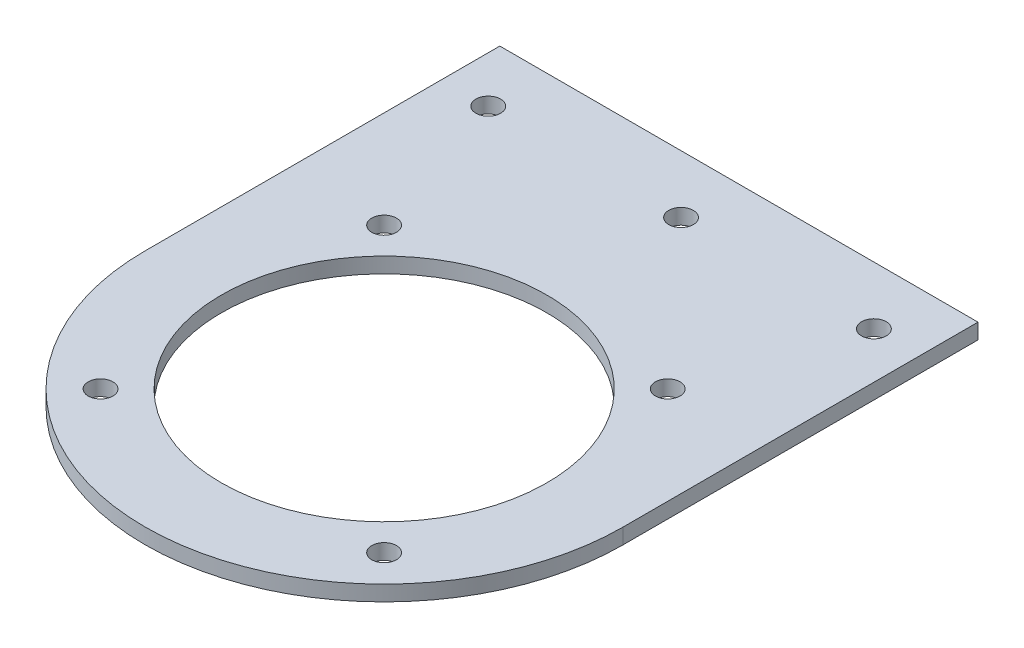
ISO-10303-21;
HEADER;
FILE_DESCRIPTION(('STEP AP214'),'2;1');
FILE_NAME('part.step','',(''),(''),'','','');
FILE_SCHEMA(('AUTOMOTIVE_DESIGN { 1 0 10303 214 1 1 1 1 }'));
ENDSEC;
DATA;
#1=APPLICATION_CONTEXT('core data for automotive mechanical design processes');
#2=APPLICATION_PROTOCOL_DEFINITION('international standard','automotive_design',2000,#1);
#3=PRODUCT_CONTEXT('',#1,'mechanical');
#4=PRODUCT('Part','Part','',(#3));
#5=PRODUCT_RELATED_PRODUCT_CATEGORY('part','',(#4));
#6=PRODUCT_DEFINITION_FORMATION('','',#4);
#7=PRODUCT_DEFINITION_CONTEXT('part definition',#1,'design');
#8=PRODUCT_DEFINITION('design','',#6,#7);
#9=PRODUCT_DEFINITION_SHAPE('','',#8);
#10=(LENGTH_UNIT() NAMED_UNIT(*) SI_UNIT(.MILLI.,.METRE.));
#11=(NAMED_UNIT(*) PLANE_ANGLE_UNIT() SI_UNIT($,.RADIAN.));
#12=(NAMED_UNIT(*) SI_UNIT($,.STERADIAN.) SOLID_ANGLE_UNIT());
#13=UNCERTAINTY_MEASURE_WITH_UNIT(LENGTH_MEASURE(1.E-05),#10,'distance_accuracy_value','');
#14=(GEOMETRIC_REPRESENTATION_CONTEXT(3) GLOBAL_UNCERTAINTY_ASSIGNED_CONTEXT((#13)) GLOBAL_UNIT_ASSIGNED_CONTEXT((#10,
#11,#12)) REPRESENTATION_CONTEXT('',''));
#15=CARTESIAN_POINT('',(0.,0.,0.));
#16=DIRECTION('',(0.,0.,1.));
#17=DIRECTION('',(1.,0.,0.));
#18=AXIS2_PLACEMENT_3D('',#15,#16,#17);
#19=CARTESIAN_POINT('',(-31.,2.,0.));
#20=DIRECTION('',(-1.,0.,0.));
#21=DIRECTION('',(0.,0.,1.));
#22=AXIS2_PLACEMENT_3D('',#19,#20,#21);
#23=PLANE('',#22);
#24=DIRECTION('',(0.,0.,-1.));
#25=VECTOR('',#24,1.);
#26=CARTESIAN_POINT('',(-31.,0.,0.));
#27=LINE('',#26,#25);
#28=CARTESIAN_POINT('',(-31.,0.,0.));
#29=VERTEX_POINT('',#28);
#30=CARTESIAN_POINT('',(-31.,0.,-46.));
#31=VERTEX_POINT('',#30);
#32=EDGE_CURVE('E148',#29,#31,#27,.T.);
#33=ORIENTED_EDGE('',*,*,#32,.F.);
#34=DIRECTION('',(0.,-1.,0.));
#35=VECTOR('',#34,1.);
#36=CARTESIAN_POINT('',(-31.,2.,0.));
#37=LINE('',#36,#35);
#38=CARTESIAN_POINT('',(-31.,2.,0.));
#39=VERTEX_POINT('',#38);
#40=EDGE_CURVE('E11',#39,#29,#37,.T.);
#41=ORIENTED_EDGE('',*,*,#40,.F.);
#42=DIRECTION('',(0.,0.,-1.));
#43=VECTOR('',#42,1.);
#44=CARTESIAN_POINT('',(-31.,2.,0.));
#45=LINE('',#44,#43);
#46=CARTESIAN_POINT('',(-31.,2.,-46.));
#47=VERTEX_POINT('',#46);
#48=EDGE_CURVE('E97',#39,#47,#45,.T.);
#49=ORIENTED_EDGE('',*,*,#48,.T.);
#50=DIRECTION('',(0.,-1.,0.));
#51=VECTOR('',#50,1.);
#52=CARTESIAN_POINT('',(-31.,2.,-46.));
#53=LINE('',#52,#51);
#54=EDGE_CURVE('E64',#47,#31,#53,.T.);
#55=ORIENTED_EDGE('',*,*,#54,.T.);
#56=EDGE_LOOP('',(#33,#41,#49,#55));
#57=FACE_BOUND('',#56,.T.);
#58=ADVANCED_FACE('F46',(#57),#23,.T.);
#59=CARTESIAN_POINT('',(0.,2.,0.));
#60=DIRECTION('',(0.,-1.,0.));
#61=DIRECTION('',(0.,0.,-1.));
#62=AXIS2_PLACEMENT_3D('',#59,#60,#61);
#63=CYLINDRICAL_SURFACE('',#62,31.);
#64=CARTESIAN_POINT('',(0.,0.,0.));
#65=DIRECTION('',(0.,1.,0.));
#66=DIRECTION('',(0.,0.,1.));
#67=AXIS2_PLACEMENT_3D('',#64,#65,#66);
#68=CIRCLE('',#67,31.);
#69=CARTESIAN_POINT('',(31.,0.,0.));
#70=VERTEX_POINT('',#69);
#71=EDGE_CURVE('E104',#29,#70,#68,.T.);
#72=ORIENTED_EDGE('',*,*,#71,.T.);
#73=DIRECTION('',(0.,-1.,0.));
#74=VECTOR('',#73,1.);
#75=CARTESIAN_POINT('',(31.,2.,0.));
#76=LINE('',#75,#74);
#77=CARTESIAN_POINT('',(31.,2.,0.));
#78=VERTEX_POINT('',#77);
#79=EDGE_CURVE('E56',#78,#70,#76,.T.);
#80=ORIENTED_EDGE('',*,*,#79,.F.);
#81=CARTESIAN_POINT('',(0.,2.,0.));
#82=DIRECTION('',(0.,1.,0.));
#83=DIRECTION('',(0.,0.,1.));
#84=AXIS2_PLACEMENT_3D('',#81,#82,#83);
#85=CIRCLE('',#84,31.);
#86=EDGE_CURVE('E90',#39,#78,#85,.T.);
#87=ORIENTED_EDGE('',*,*,#86,.F.);
#88=ORIENTED_EDGE('',*,*,#40,.T.);
#89=EDGE_LOOP('',(#72,#80,#87,#88));
#90=FACE_BOUND('',#89,.T.);
#91=ADVANCED_FACE('F102',(#90),#63,.T.);
#92=CARTESIAN_POINT('',(31.,2.,0.));
#93=DIRECTION('',(1.,0.,0.));
#94=DIRECTION('',(0.,0.,-1.));
#95=AXIS2_PLACEMENT_3D('',#92,#93,#94);
#96=PLANE('',#95);
#97=DIRECTION('',(0.,0.,1.));
#98=VECTOR('',#97,1.);
#99=CARTESIAN_POINT('',(31.,0.,0.));
#100=LINE('',#99,#98);
#101=CARTESIAN_POINT('',(31.,0.,-46.));
#102=VERTEX_POINT('',#101);
#103=EDGE_CURVE('E153',#102,#70,#100,.T.);
#104=ORIENTED_EDGE('',*,*,#103,.F.);
#105=DIRECTION('',(0.,-1.,0.));
#106=VECTOR('',#105,1.);
#107=CARTESIAN_POINT('',(31.,2.,-46.));
#108=LINE('',#107,#106);
#109=CARTESIAN_POINT('',(31.,2.,-46.));
#110=VERTEX_POINT('',#109);
#111=EDGE_CURVE('E77',#110,#102,#108,.T.);
#112=ORIENTED_EDGE('',*,*,#111,.F.);
#113=DIRECTION('',(0.,0.,1.));
#114=VECTOR('',#113,1.);
#115=CARTESIAN_POINT('',(31.,2.,0.));
#116=LINE('',#115,#114);
#117=EDGE_CURVE('E96',#110,#78,#116,.T.);
#118=ORIENTED_EDGE('',*,*,#117,.T.);
#119=ORIENTED_EDGE('',*,*,#79,.T.);
#120=EDGE_LOOP('',(#104,#112,#118,#119));
#121=FACE_BOUND('',#120,.T.);
#122=ADVANCED_FACE('F108',(#121),#96,.T.);
#123=CARTESIAN_POINT('',(18.3847763108503,2.,-18.3847763108502));
#124=DIRECTION('',(0.,-1.,0.));
#125=DIRECTION('',(0.,0.,-1.));
#126=AXIS2_PLACEMENT_3D('',#123,#124,#125);
#127=CYLINDRICAL_SURFACE('',#126,1.60000000000001);
#128=CARTESIAN_POINT('',(18.3847763108503,2.,-18.3847763108502));
#129=DIRECTION('',(0.,1.,0.));
#130=DIRECTION('',(0.,0.,1.));
#131=AXIS2_PLACEMENT_3D('',#128,#129,#130);
#132=CIRCLE('',#131,1.60000000000001);
#133=CARTESIAN_POINT('',(18.3847763108503,2.,-16.7847763108502));
#134=VERTEX_POINT('',#133);
#135=EDGE_CURVE('E128',#134,#134,#132,.T.);
#136=ORIENTED_EDGE('',*,*,#135,.T.);
#137=EDGE_LOOP('',(#136));
#138=FACE_BOUND('',#137,.T.);
#139=CARTESIAN_POINT('',(18.3847763108503,0.,-18.3847763108502));
#140=DIRECTION('',(0.,1.,0.));
#141=DIRECTION('',(0.,0.,1.));
#142=AXIS2_PLACEMENT_3D('',#139,#140,#141);
#143=CIRCLE('',#142,1.60000000000001);
#144=CARTESIAN_POINT('',(18.3847763108503,0.,-16.7847763108502));
#145=VERTEX_POINT('',#144);
#146=EDGE_CURVE('E172',#145,#145,#143,.T.);
#147=ORIENTED_EDGE('',*,*,#146,.F.);
#148=EDGE_LOOP('',(#147));
#149=FACE_BOUND('',#148,.T.);
#150=ADVANCED_FACE('F248',(#138,#149),#127,.F.);
#151=CARTESIAN_POINT('',(18.3847763108501,2.,18.3847763108503));
#152=DIRECTION('',(0.,-1.,0.));
#153=DIRECTION('',(0.,0.,-1.));
#154=AXIS2_PLACEMENT_3D('',#151,#152,#153);
#155=CYLINDRICAL_SURFACE('',#154,1.6);
#156=CARTESIAN_POINT('',(18.3847763108501,2.,18.3847763108503));
#157=DIRECTION('',(0.,1.,0.));
#158=DIRECTION('',(0.,0.,1.));
#159=AXIS2_PLACEMENT_3D('',#156,#157,#158);
#160=CIRCLE('',#159,1.6);
#161=CARTESIAN_POINT('',(18.3847763108501,2.,19.9847763108503));
#162=VERTEX_POINT('',#161);
#163=EDGE_CURVE('E124',#162,#162,#160,.T.);
#164=ORIENTED_EDGE('',*,*,#163,.T.);
#165=EDGE_LOOP('',(#164));
#166=FACE_BOUND('',#165,.T.);
#167=CARTESIAN_POINT('',(18.3847763108501,0.,18.3847763108503));
#168=DIRECTION('',(0.,1.,0.));
#169=DIRECTION('',(0.,0.,1.));
#170=AXIS2_PLACEMENT_3D('',#167,#168,#169);
#171=CIRCLE('',#170,1.6);
#172=CARTESIAN_POINT('',(18.3847763108501,0.,19.9847763108503));
#173=VERTEX_POINT('',#172);
#174=EDGE_CURVE('E168',#173,#173,#171,.T.);
#175=ORIENTED_EDGE('',*,*,#174,.F.);
#176=EDGE_LOOP('',(#175));
#177=FACE_BOUND('',#176,.T.);
#178=ADVANCED_FACE('F250',(#166,#177),#155,.F.);
#179=CARTESIAN_POINT('',(-18.3847763108504,2.,18.3847763108501));
#180=DIRECTION('',(0.,-1.,0.));
#181=DIRECTION('',(0.,0.,-1.));
#182=AXIS2_PLACEMENT_3D('',#179,#180,#181);
#183=CYLINDRICAL_SURFACE('',#182,1.6);
#184=CARTESIAN_POINT('',(-18.3847763108504,2.,18.3847763108501));
#185=DIRECTION('',(0.,1.,0.));
#186=DIRECTION('',(0.,0.,1.));
#187=AXIS2_PLACEMENT_3D('',#184,#185,#186);
#188=CIRCLE('',#187,1.6);
#189=CARTESIAN_POINT('',(-18.3847763108504,2.,19.9847763108501));
#190=VERTEX_POINT('',#189);
#191=EDGE_CURVE('E120',#190,#190,#188,.T.);
#192=ORIENTED_EDGE('',*,*,#191,.T.);
#193=EDGE_LOOP('',(#192));
#194=FACE_BOUND('',#193,.T.);
#195=CARTESIAN_POINT('',(-18.3847763108504,0.,18.3847763108501));
#196=DIRECTION('',(0.,1.,0.));
#197=DIRECTION('',(0.,0.,1.));
#198=AXIS2_PLACEMENT_3D('',#195,#196,#197);
#199=CIRCLE('',#198,1.6);
#200=CARTESIAN_POINT('',(-18.3847763108504,0.,19.9847763108501));
#201=VERTEX_POINT('',#200);
#202=EDGE_CURVE('E164',#201,#201,#199,.T.);
#203=ORIENTED_EDGE('',*,*,#202,.F.);
#204=EDGE_LOOP('',(#203));
#205=FACE_BOUND('',#204,.T.);
#206=ADVANCED_FACE('F212',(#194,#205),#183,.F.);
#207=CARTESIAN_POINT('',(-18.38477631085,2.,-18.3847763108505));
#208=DIRECTION('',(0.,-1.,0.));
#209=DIRECTION('',(0.,0.,-1.));
#210=AXIS2_PLACEMENT_3D('',#207,#208,#209);
#211=CYLINDRICAL_SURFACE('',#210,1.6);
#212=CARTESIAN_POINT('',(-18.38477631085,2.,-18.3847763108505));
#213=DIRECTION('',(0.,1.,0.));
#214=DIRECTION('',(0.,0.,1.));
#215=AXIS2_PLACEMENT_3D('',#212,#213,#214);
#216=CIRCLE('',#215,1.6);
#217=CARTESIAN_POINT('',(-18.38477631085,2.,-16.7847763108505));
#218=VERTEX_POINT('',#217);
#219=EDGE_CURVE('E113',#218,#218,#216,.T.);
#220=ORIENTED_EDGE('',*,*,#219,.T.);
#221=EDGE_LOOP('',(#220));
#222=FACE_BOUND('',#221,.T.);
#223=CARTESIAN_POINT('',(-18.38477631085,0.,-18.3847763108505));
#224=DIRECTION('',(0.,1.,0.));
#225=DIRECTION('',(0.,0.,1.));
#226=AXIS2_PLACEMENT_3D('',#223,#224,#225);
#227=CIRCLE('',#226,1.6);
#228=CARTESIAN_POINT('',(-18.38477631085,0.,-16.7847763108505));
#229=VERTEX_POINT('',#228);
#230=EDGE_CURVE('E160',#229,#229,#227,.T.);
#231=ORIENTED_EDGE('',*,*,#230,.F.);
#232=EDGE_LOOP('',(#231));
#233=FACE_BOUND('',#232,.T.);
#234=ADVANCED_FACE('F203',(#222,#233),#211,.F.);
#235=CARTESIAN_POINT('',(0.,2.,-46.));
#236=DIRECTION('',(0.,0.,-1.));
#237=DIRECTION('',(-1.,0.,0.));
#238=AXIS2_PLACEMENT_3D('',#235,#236,#237);
#239=PLANE('',#238);
#240=DIRECTION('',(1.,0.,0.));
#241=VECTOR('',#240,1.);
#242=CARTESIAN_POINT('',(0.,0.,-46.));
#243=LINE('',#242,#241);
#244=EDGE_CURVE('E156',#31,#102,#243,.T.);
#245=ORIENTED_EDGE('',*,*,#244,.F.);
#246=ORIENTED_EDGE('',*,*,#54,.F.);
#247=DIRECTION('',(1.,0.,0.));
#248=VECTOR('',#247,1.);
#249=CARTESIAN_POINT('',(0.,2.,-46.));
#250=LINE('',#249,#248);
#251=EDGE_CURVE('E110',#47,#110,#250,.T.);
#252=ORIENTED_EDGE('',*,*,#251,.T.);
#253=ORIENTED_EDGE('',*,*,#111,.T.);
#254=EDGE_LOOP('',(#245,#246,#252,#253));
#255=FACE_BOUND('',#254,.T.);
#256=ADVANCED_FACE('F200',(#255),#239,.T.);
#257=CARTESIAN_POINT('',(-25.,2.,-38.5));
#258=DIRECTION('',(0.,-1.,0.));
#259=DIRECTION('',(0.,0.,-1.));
#260=AXIS2_PLACEMENT_3D('',#257,#258,#259);
#261=CYLINDRICAL_SURFACE('',#260,1.6);
#262=CARTESIAN_POINT('',(-25.,2.,-38.5));
#263=DIRECTION('',(0.,1.,0.));
#264=DIRECTION('',(0.,0.,1.));
#265=AXIS2_PLACEMENT_3D('',#262,#263,#264);
#266=CIRCLE('',#265,1.6);
#267=CARTESIAN_POINT('',(-25.,2.,-36.9));
#268=VERTEX_POINT('',#267);
#269=EDGE_CURVE('E194',#268,#268,#266,.T.);
#270=ORIENTED_EDGE('',*,*,#269,.T.);
#271=EDGE_LOOP('',(#270));
#272=FACE_BOUND('',#271,.T.);
#273=CARTESIAN_POINT('',(-25.,0.,-38.5));
#274=DIRECTION('',(0.,1.,0.));
#275=DIRECTION('',(0.,0.,1.));
#276=AXIS2_PLACEMENT_3D('',#273,#274,#275);
#277=CIRCLE('',#276,1.6);
#278=CARTESIAN_POINT('',(-25.,0.,-36.9));
#279=VERTEX_POINT('',#278);
#280=EDGE_CURVE('E144',#279,#279,#277,.T.);
#281=ORIENTED_EDGE('',*,*,#280,.F.);
#282=EDGE_LOOP('',(#281));
#283=FACE_BOUND('',#282,.T.);
#284=ADVANCED_FACE('F202',(#272,#283),#261,.F.);
#285=CARTESIAN_POINT('',(0.,2.,-38.5));
#286=DIRECTION('',(0.,-1.,0.));
#287=DIRECTION('',(0.,0.,-1.));
#288=AXIS2_PLACEMENT_3D('',#285,#286,#287);
#289=CYLINDRICAL_SURFACE('',#288,1.6);
#290=CARTESIAN_POINT('',(0.,2.,-38.5));
#291=DIRECTION('',(0.,1.,0.));
#292=DIRECTION('',(0.,0.,1.));
#293=AXIS2_PLACEMENT_3D('',#290,#291,#292);
#294=CIRCLE('',#293,1.6);
#295=CARTESIAN_POINT('',(0.,2.,-36.9));
#296=VERTEX_POINT('',#295);
#297=EDGE_CURVE('E188',#296,#296,#294,.T.);
#298=ORIENTED_EDGE('',*,*,#297,.T.);
#299=EDGE_LOOP('',(#298));
#300=FACE_BOUND('',#299,.T.);
#301=CARTESIAN_POINT('',(0.,0.,-38.5));
#302=DIRECTION('',(0.,1.,0.));
#303=DIRECTION('',(0.,0.,1.));
#304=AXIS2_PLACEMENT_3D('',#301,#302,#303);
#305=CIRCLE('',#304,1.6);
#306=CARTESIAN_POINT('',(0.,0.,-36.9));
#307=VERTEX_POINT('',#306);
#308=EDGE_CURVE('E140',#307,#307,#305,.T.);
#309=ORIENTED_EDGE('',*,*,#308,.F.);
#310=EDGE_LOOP('',(#309));
#311=FACE_BOUND('',#310,.T.);
#312=ADVANCED_FACE('F209',(#300,#311),#289,.F.);
#313=CARTESIAN_POINT('',(25.,2.,-38.5));
#314=DIRECTION('',(0.,-1.,0.));
#315=DIRECTION('',(0.,0.,-1.));
#316=AXIS2_PLACEMENT_3D('',#313,#314,#315);
#317=CYLINDRICAL_SURFACE('',#316,1.6);
#318=CARTESIAN_POINT('',(25.,2.,-38.5));
#319=DIRECTION('',(0.,1.,0.));
#320=DIRECTION('',(0.,0.,1.));
#321=AXIS2_PLACEMENT_3D('',#318,#319,#320);
#322=CIRCLE('',#321,1.6);
#323=CARTESIAN_POINT('',(25.,2.,-36.9));
#324=VERTEX_POINT('',#323);
#325=EDGE_CURVE('E180',#324,#324,#322,.T.);
#326=ORIENTED_EDGE('',*,*,#325,.T.);
#327=EDGE_LOOP('',(#326));
#328=FACE_BOUND('',#327,.T.);
#329=CARTESIAN_POINT('',(25.,0.,-38.5));
#330=DIRECTION('',(0.,1.,0.));
#331=DIRECTION('',(0.,0.,1.));
#332=AXIS2_PLACEMENT_3D('',#329,#330,#331);
#333=CIRCLE('',#332,1.6);
#334=CARTESIAN_POINT('',(25.,0.,-36.9));
#335=VERTEX_POINT('',#334);
#336=EDGE_CURVE('E136',#335,#335,#333,.T.);
#337=ORIENTED_EDGE('',*,*,#336,.F.);
#338=EDGE_LOOP('',(#337));
#339=FACE_BOUND('',#338,.T.);
#340=ADVANCED_FACE('F48',(#328,#339),#317,.F.);
#341=CARTESIAN_POINT('',(0.,2.,0.));
#342=DIRECTION('',(0.,-1.,0.));
#343=DIRECTION('',(0.,0.,-1.));
#344=AXIS2_PLACEMENT_3D('',#341,#342,#343);
#345=CYLINDRICAL_SURFACE('',#344,21.1);
#346=CARTESIAN_POINT('',(0.,2.,0.));
#347=DIRECTION('',(0.,1.,0.));
#348=DIRECTION('',(0.,0.,1.));
#349=AXIS2_PLACEMENT_3D('',#346,#347,#348);
#350=CIRCLE('',#349,21.1);
#351=CARTESIAN_POINT('',(0.,2.,21.1));
#352=VERTEX_POINT('',#351);
#353=EDGE_CURVE('E132',#352,#352,#350,.T.);
#354=ORIENTED_EDGE('',*,*,#353,.T.);
#355=EDGE_LOOP('',(#354));
#356=FACE_BOUND('',#355,.T.);
#357=CARTESIAN_POINT('',(0.,0.,0.));
#358=DIRECTION('',(0.,1.,0.));
#359=DIRECTION('',(0.,0.,1.));
#360=AXIS2_PLACEMENT_3D('',#357,#358,#359);
#361=CIRCLE('',#360,21.1);
#362=CARTESIAN_POINT('',(0.,0.,21.1));
#363=VERTEX_POINT('',#362);
#364=EDGE_CURVE('E176',#363,#363,#361,.T.);
#365=ORIENTED_EDGE('',*,*,#364,.F.);
#366=EDGE_LOOP('',(#365));
#367=FACE_BOUND('',#366,.T.);
#368=ADVANCED_FACE('F227',(#356,#367),#345,.F.);
#369=CARTESIAN_POINT('',(0.,2.,0.));
#370=DIRECTION('',(0.,1.,0.));
#371=DIRECTION('',(0.,0.,1.));
#372=AXIS2_PLACEMENT_3D('',#369,#370,#371);
#373=PLANE('',#372);
#374=ORIENTED_EDGE('',*,*,#325,.F.);
#375=EDGE_LOOP('',(#374));
#376=FACE_BOUND('',#375,.T.);
#377=ORIENTED_EDGE('',*,*,#297,.F.);
#378=EDGE_LOOP('',(#377));
#379=FACE_BOUND('',#378,.T.);
#380=ORIENTED_EDGE('',*,*,#269,.F.);
#381=EDGE_LOOP('',(#380));
#382=FACE_BOUND('',#381,.T.);
#383=ORIENTED_EDGE('',*,*,#48,.F.);
#384=ORIENTED_EDGE('',*,*,#86,.T.);
#385=ORIENTED_EDGE('',*,*,#117,.F.);
#386=ORIENTED_EDGE('',*,*,#251,.F.);
#387=EDGE_LOOP('',(#383,#384,#385,#386));
#388=FACE_BOUND('',#387,.T.);
#389=ORIENTED_EDGE('',*,*,#219,.F.);
#390=EDGE_LOOP('',(#389));
#391=FACE_BOUND('',#390,.T.);
#392=ORIENTED_EDGE('',*,*,#191,.F.);
#393=EDGE_LOOP('',(#392));
#394=FACE_BOUND('',#393,.T.);
#395=ORIENTED_EDGE('',*,*,#163,.F.);
#396=EDGE_LOOP('',(#395));
#397=FACE_BOUND('',#396,.T.);
#398=ORIENTED_EDGE('',*,*,#135,.F.);
#399=EDGE_LOOP('',(#398));
#400=FACE_BOUND('',#399,.T.);
#401=ORIENTED_EDGE('',*,*,#353,.F.);
#402=EDGE_LOOP('',(#401));
#403=FACE_BOUND('',#402,.T.);
#404=ADVANCED_FACE('F92',(#376,#379,#382,#388,#391,#394,#397,#400,#403),#373,.T.);
#405=CARTESIAN_POINT('',(0.,0.,0.));
#406=DIRECTION('',(0.,1.,0.));
#407=DIRECTION('',(0.,0.,1.));
#408=AXIS2_PLACEMENT_3D('',#405,#406,#407);
#409=PLANE('',#408);
#410=ORIENTED_EDGE('',*,*,#336,.T.);
#411=EDGE_LOOP('',(#410));
#412=FACE_BOUND('',#411,.T.);
#413=ORIENTED_EDGE('',*,*,#308,.T.);
#414=EDGE_LOOP('',(#413));
#415=FACE_BOUND('',#414,.T.);
#416=ORIENTED_EDGE('',*,*,#280,.T.);
#417=EDGE_LOOP('',(#416));
#418=FACE_BOUND('',#417,.T.);
#419=ORIENTED_EDGE('',*,*,#32,.T.);
#420=ORIENTED_EDGE('',*,*,#244,.T.);
#421=ORIENTED_EDGE('',*,*,#103,.T.);
#422=ORIENTED_EDGE('',*,*,#71,.F.);
#423=EDGE_LOOP('',(#419,#420,#421,#422));
#424=FACE_BOUND('',#423,.T.);
#425=ORIENTED_EDGE('',*,*,#230,.T.);
#426=EDGE_LOOP('',(#425));
#427=FACE_BOUND('',#426,.T.);
#428=ORIENTED_EDGE('',*,*,#202,.T.);
#429=EDGE_LOOP('',(#428));
#430=FACE_BOUND('',#429,.T.);
#431=ORIENTED_EDGE('',*,*,#174,.T.);
#432=EDGE_LOOP('',(#431));
#433=FACE_BOUND('',#432,.T.);
#434=ORIENTED_EDGE('',*,*,#146,.T.);
#435=EDGE_LOOP('',(#434));
#436=FACE_BOUND('',#435,.T.);
#437=ORIENTED_EDGE('',*,*,#364,.T.);
#438=EDGE_LOOP('',(#437));
#439=FACE_BOUND('',#438,.T.);
#440=ADVANCED_FACE('F232',(#412,#415,#418,#424,#427,#430,#433,#436,#439),#409,.F.);
#441=CLOSED_SHELL('',(#58,#91,#122,#150,#178,#206,#234,#256,#284,#312,#340,#368,#404,#440));
#442=MANIFOLD_SOLID_BREP('B2',#441);
#443=ADVANCED_BREP_SHAPE_REPRESENTATION('',(#18,#442),#14);
#444=SHAPE_DEFINITION_REPRESENTATION(#9,#443);
ENDSEC;
END-ISO-10303-21;
